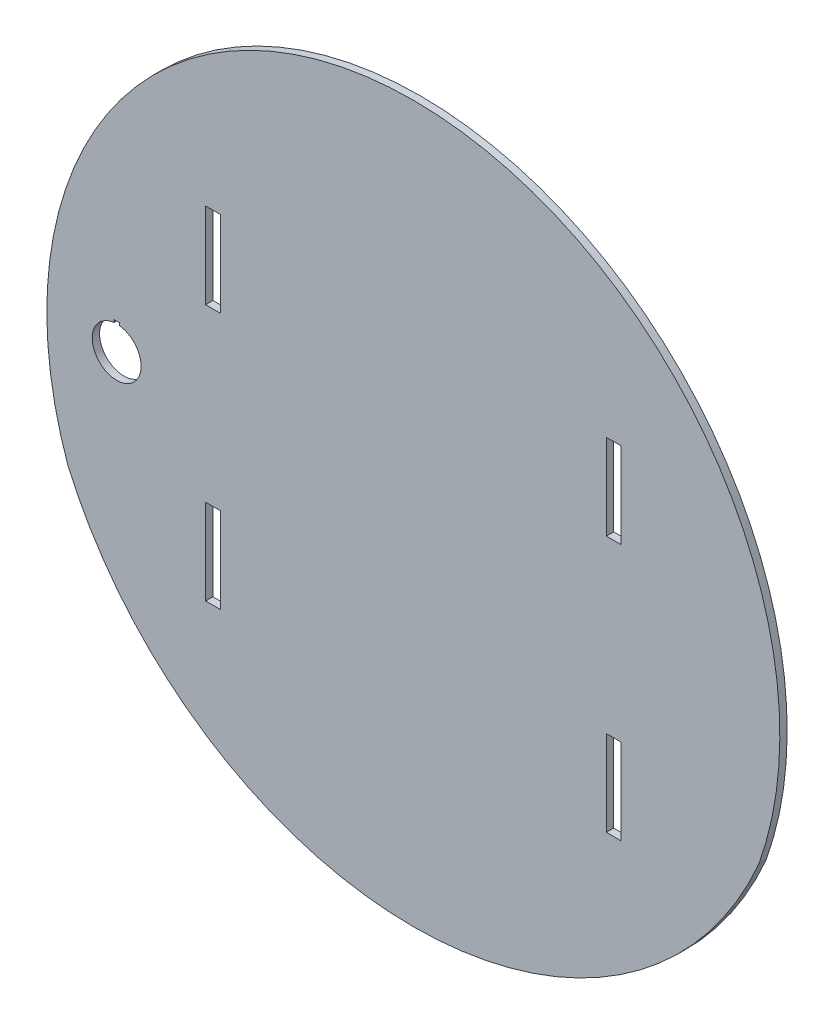
ISO-10303-21;
HEADER;
FILE_DESCRIPTION(('STEP AP214'),'2;1');
FILE_NAME('part.step','',(''),(''),'','','');
FILE_SCHEMA(('AUTOMOTIVE_DESIGN { 1 0 10303 214 1 1 1 1 }'));
ENDSEC;
DATA;
#1=APPLICATION_CONTEXT('core data for automotive mechanical design processes');
#2=APPLICATION_PROTOCOL_DEFINITION('international standard','automotive_design',2000,#1);
#3=PRODUCT_CONTEXT('',#1,'mechanical');
#4=PRODUCT('Part','Part','',(#3));
#5=PRODUCT_RELATED_PRODUCT_CATEGORY('part','',(#4));
#6=PRODUCT_DEFINITION_FORMATION('','',#4);
#7=PRODUCT_DEFINITION_CONTEXT('part definition',#1,'design');
#8=PRODUCT_DEFINITION('design','',#6,#7);
#9=PRODUCT_DEFINITION_SHAPE('','',#8);
#10=(LENGTH_UNIT() NAMED_UNIT(*) SI_UNIT(.MILLI.,.METRE.));
#11=(NAMED_UNIT(*) PLANE_ANGLE_UNIT() SI_UNIT($,.RADIAN.));
#12=(NAMED_UNIT(*) SI_UNIT($,.STERADIAN.) SOLID_ANGLE_UNIT());
#13=UNCERTAINTY_MEASURE_WITH_UNIT(LENGTH_MEASURE(1.E-05),#10,'distance_accuracy_value','');
#14=(GEOMETRIC_REPRESENTATION_CONTEXT(3) GLOBAL_UNCERTAINTY_ASSIGNED_CONTEXT((#13)) GLOBAL_UNIT_ASSIGNED_CONTEXT((#10,
#11,#12)) REPRESENTATION_CONTEXT('',''));
#15=CARTESIAN_POINT('',(0.,0.,0.));
#16=DIRECTION('',(0.,0.,1.));
#17=DIRECTION('',(1.,0.,0.));
#18=AXIS2_PLACEMENT_3D('',#15,#16,#17);
#19=CARTESIAN_POINT('',(0.,5.54868131109093,3.));
#20=DIRECTION('',(0.,0.,-1.));
#21=DIRECTION('',(-1.,0.,0.));
#22=AXIS2_PLACEMENT_3D('',#19,#20,#21);
#23=PLANE('',#22);
#24=DIRECTION('',(0.,1.,0.));
#25=VECTOR('',#24,1.);
#26=CARTESIAN_POINT('',(85.0000000000001,-70.,3.));
#27=LINE('',#26,#25);
#28=CARTESIAN_POINT('',(85.0000000000001,-70.,3.));
#29=VERTEX_POINT('',#28);
#30=CARTESIAN_POINT('',(85.0000000000001,-35.,3.));
#31=VERTEX_POINT('',#30);
#32=EDGE_CURVE('E218',#29,#31,#27,.T.);
#33=ORIENTED_EDGE('',*,*,#32,.F.);
#34=DIRECTION('',(1.,0.,0.));
#35=VECTOR('',#34,1.);
#36=CARTESIAN_POINT('',(85.0000000000001,-70.,3.));
#37=LINE('',#36,#35);
#38=CARTESIAN_POINT('',(79.0000000000001,-70.,3.));
#39=VERTEX_POINT('',#38);
#40=EDGE_CURVE('E226',#39,#29,#37,.T.);
#41=ORIENTED_EDGE('',*,*,#40,.F.);
#42=DIRECTION('',(0.,-1.,0.));
#43=VECTOR('',#42,1.);
#44=CARTESIAN_POINT('',(79.0000000000001,-70.,3.));
#45=LINE('',#44,#43);
#46=CARTESIAN_POINT('',(79.0000000000001,-35.,3.));
#47=VERTEX_POINT('',#46);
#48=EDGE_CURVE('E223',#47,#39,#45,.T.);
#49=ORIENTED_EDGE('',*,*,#48,.F.);
#50=DIRECTION('',(-1.,0.,0.));
#51=VECTOR('',#50,1.);
#52=CARTESIAN_POINT('',(85.0000000000001,-35.,3.));
#53=LINE('',#52,#51);
#54=EDGE_CURVE('E220',#31,#47,#53,.T.);
#55=ORIENTED_EDGE('',*,*,#54,.F.);
#56=EDGE_LOOP('',(#33,#41,#49,#55));
#57=FACE_BOUND('',#56,.T.);
#58=DIRECTION('',(0.,-1.,0.));
#59=VECTOR('',#58,1.);
#60=CARTESIAN_POINT('',(-122.52135623731,11.,3.));
#61=LINE('',#60,#59);
#62=CARTESIAN_POINT('',(-122.52135623731,11.,3.));
#63=VERTEX_POINT('',#62);
#64=CARTESIAN_POINT('',(-122.52135623731,9.93931587182939,3.));
#65=VERTEX_POINT('',#64);
#66=EDGE_CURVE('E280',#63,#65,#61,.T.);
#67=ORIENTED_EDGE('',*,*,#66,.F.);
#68=DIRECTION('',(-1.,0.,0.));
#69=VECTOR('',#68,1.);
#70=CARTESIAN_POINT('',(-120.32135623731,11.,3.));
#71=LINE('',#70,#69);
#72=CARTESIAN_POINT('',(-120.32135623731,11.,3.));
#73=VERTEX_POINT('',#72);
#74=EDGE_CURVE('E288',#73,#63,#71,.T.);
#75=ORIENTED_EDGE('',*,*,#74,.F.);
#76=DIRECTION('',(0.,1.,0.));
#77=VECTOR('',#76,1.);
#78=CARTESIAN_POINT('',(-120.32135623731,11.,3.));
#79=LINE('',#78,#77);
#80=CARTESIAN_POINT('',(-120.32135623731,9.93931587182939,3.));
#81=VERTEX_POINT('',#80);
#82=EDGE_CURVE('E285',#81,#73,#79,.T.);
#83=ORIENTED_EDGE('',*,*,#82,.F.);
#84=CARTESIAN_POINT('',(-121.42135623731,0.,3.));
#85=DIRECTION('',(0.,0.,1.));
#86=DIRECTION('',(1.,0.,0.));
#87=AXIS2_PLACEMENT_3D('',#84,#85,#86);
#88=CIRCLE('',#87,10.);
#89=EDGE_CURVE('E282',#65,#81,#88,.T.);
#90=ORIENTED_EDGE('',*,*,#89,.F.);
#91=EDGE_LOOP('',(#67,#75,#83,#90));
#92=FACE_BOUND('',#91,.T.);
#93=CARTESIAN_POINT('',(0.,11.0973626221819,3.));
#94=DIRECTION('',(0.,0.,1.));
#95=DIRECTION('',(-1.,0.,0.));
#96=AXIS2_PLACEMENT_3D('',#93,#94,#95);
#97=CIRCLE('',#96,154.054820500322);
#98=CARTESIAN_POINT('',(-141.42135623731,-49.9999999999998,3.));
#99=VERTEX_POINT('',#98);
#100=CARTESIAN_POINT('',(141.421356237309,-50.,3.));
#101=VERTEX_POINT('',#100);
#102=EDGE_CURVE('E342',#99,#101,#97,.T.);
#103=ORIENTED_EDGE('',*,*,#102,.T.);
#104=CARTESIAN_POINT('',(0.,0.,3.));
#105=DIRECTION('',(0.,0.,1.));
#106=DIRECTION('',(1.,0.,0.));
#107=AXIS2_PLACEMENT_3D('',#104,#105,#106);
#108=CIRCLE('',#107,150.);
#109=EDGE_CURVE('E345',#101,#99,#108,.T.);
#110=ORIENTED_EDGE('',*,*,#109,.T.);
#111=EDGE_LOOP('',(#103,#110));
#112=FACE_BOUND('',#111,.T.);
#113=DIRECTION('',(1.,0.,0.));
#114=VECTOR('',#113,1.);
#115=CARTESIAN_POINT('',(-85.,-70.,3.));
#116=LINE('',#115,#114);
#117=CARTESIAN_POINT('',(-85.,-70.,3.));
#118=VERTEX_POINT('',#117);
#119=CARTESIAN_POINT('',(-79.,-70.,3.));
#120=VERTEX_POINT('',#119);
#121=EDGE_CURVE('E311',#118,#120,#116,.T.);
#122=ORIENTED_EDGE('',*,*,#121,.F.);
#123=DIRECTION('',(0.,-1.,0.));
#124=VECTOR('',#123,1.);
#125=CARTESIAN_POINT('',(-85.,-70.,3.));
#126=LINE('',#125,#124);
#127=CARTESIAN_POINT('',(-85.,-35.,3.));
#128=VERTEX_POINT('',#127);
#129=EDGE_CURVE('E319',#128,#118,#126,.T.);
#130=ORIENTED_EDGE('',*,*,#129,.F.);
#131=DIRECTION('',(-1.,0.,0.));
#132=VECTOR('',#131,1.);
#133=CARTESIAN_POINT('',(-85.,-35.,3.));
#134=LINE('',#133,#132);
#135=CARTESIAN_POINT('',(-79.,-35.,3.));
#136=VERTEX_POINT('',#135);
#137=EDGE_CURVE('E316',#136,#128,#134,.T.);
#138=ORIENTED_EDGE('',*,*,#137,.F.);
#139=DIRECTION('',(0.,1.,0.));
#140=VECTOR('',#139,1.);
#141=CARTESIAN_POINT('',(-79.,-70.,3.));
#142=LINE('',#141,#140);
#143=EDGE_CURVE('E313',#120,#136,#142,.T.);
#144=ORIENTED_EDGE('',*,*,#143,.F.);
#145=EDGE_LOOP('',(#122,#130,#138,#144));
#146=FACE_BOUND('',#145,.T.);
#147=DIRECTION('',(0.,-1.,0.));
#148=VECTOR('',#147,1.);
#149=CARTESIAN_POINT('',(-85.,35.,3.));
#150=LINE('',#149,#148);
#151=CARTESIAN_POINT('',(-85.,70.,3.));
#152=VERTEX_POINT('',#151);
#153=CARTESIAN_POINT('',(-85.,35.,3.));
#154=VERTEX_POINT('',#153);
#155=EDGE_CURVE('E249',#152,#154,#150,.T.);
#156=ORIENTED_EDGE('',*,*,#155,.F.);
#157=DIRECTION('',(-1.,0.,0.));
#158=VECTOR('',#157,1.);
#159=CARTESIAN_POINT('',(-85.,70.,3.));
#160=LINE('',#159,#158);
#161=CARTESIAN_POINT('',(-79.,70.,3.));
#162=VERTEX_POINT('',#161);
#163=EDGE_CURVE('E257',#162,#152,#160,.T.);
#164=ORIENTED_EDGE('',*,*,#163,.F.);
#165=DIRECTION('',(0.,1.,0.));
#166=VECTOR('',#165,1.);
#167=CARTESIAN_POINT('',(-79.,35.,3.));
#168=LINE('',#167,#166);
#169=CARTESIAN_POINT('',(-79.,35.,3.));
#170=VERTEX_POINT('',#169);
#171=EDGE_CURVE('E254',#170,#162,#168,.T.);
#172=ORIENTED_EDGE('',*,*,#171,.F.);
#173=DIRECTION('',(1.,0.,0.));
#174=VECTOR('',#173,1.);
#175=CARTESIAN_POINT('',(-85.,35.,3.));
#176=LINE('',#175,#174);
#177=EDGE_CURVE('E251',#154,#170,#176,.T.);
#178=ORIENTED_EDGE('',*,*,#177,.F.);
#179=EDGE_LOOP('',(#156,#164,#172,#178));
#180=FACE_BOUND('',#179,.T.);
#181=DIRECTION('',(1.,0.,0.));
#182=VECTOR('',#181,1.);
#183=CARTESIAN_POINT('',(85.,35.,3.));
#184=LINE('',#183,#182);
#185=CARTESIAN_POINT('',(79.,35.,3.));
#186=VERTEX_POINT('',#185);
#187=CARTESIAN_POINT('',(85.,35.,3.));
#188=VERTEX_POINT('',#187);
#189=EDGE_CURVE('E182',#186,#188,#184,.T.);
#190=ORIENTED_EDGE('',*,*,#189,.F.);
#191=DIRECTION('',(0.,-1.,0.));
#192=VECTOR('',#191,1.);
#193=CARTESIAN_POINT('',(79.,35.,3.));
#194=LINE('',#193,#192);
#195=CARTESIAN_POINT('',(79.0000000000001,70.,3.));
#196=VERTEX_POINT('',#195);
#197=EDGE_CURVE('E204',#196,#186,#194,.T.);
#198=ORIENTED_EDGE('',*,*,#197,.F.);
#199=DIRECTION('',(-1.,0.,0.));
#200=VECTOR('',#199,1.);
#201=CARTESIAN_POINT('',(85.0000000000001,70.,3.));
#202=LINE('',#201,#200);
#203=CARTESIAN_POINT('',(85.0000000000001,70.,3.));
#204=VERTEX_POINT('',#203);
#205=EDGE_CURVE('E202',#204,#196,#202,.T.);
#206=ORIENTED_EDGE('',*,*,#205,.F.);
#207=DIRECTION('',(0.,1.,0.));
#208=VECTOR('',#207,1.);
#209=CARTESIAN_POINT('',(85.,35.,3.));
#210=LINE('',#209,#208);
#211=EDGE_CURVE('E190',#188,#204,#210,.T.);
#212=ORIENTED_EDGE('',*,*,#211,.F.);
#213=EDGE_LOOP('',(#190,#198,#206,#212));
#214=FACE_BOUND('',#213,.T.);
#215=ADVANCED_FACE('F33',(#57,#92,#112,#146,#180,#214),#23,.F.);
#216=CARTESIAN_POINT('',(0.,5.54868131109093,0.));
#217=DIRECTION('',(0.,0.,-1.));
#218=DIRECTION('',(-1.,0.,0.));
#219=AXIS2_PLACEMENT_3D('',#216,#217,#218);
#220=PLANE('',#219);
#221=CARTESIAN_POINT('',(0.,11.0973626221819,0.));
#222=DIRECTION('',(0.,0.,1.));
#223=DIRECTION('',(-1.,0.,0.));
#224=AXIS2_PLACEMENT_3D('',#221,#222,#223);
#225=CIRCLE('',#224,154.054820500322);
#226=CARTESIAN_POINT('',(-141.42135623731,-49.9999999999998,0.));
#227=VERTEX_POINT('',#226);
#228=CARTESIAN_POINT('',(141.421356237309,-50.,0.));
#229=VERTEX_POINT('',#228);
#230=EDGE_CURVE('E341',#227,#229,#225,.T.);
#231=ORIENTED_EDGE('',*,*,#230,.F.);
#232=CARTESIAN_POINT('',(0.,0.,0.));
#233=DIRECTION('',(0.,0.,1.));
#234=DIRECTION('',(1.,0.,0.));
#235=AXIS2_PLACEMENT_3D('',#232,#233,#234);
#236=CIRCLE('',#235,150.);
#237=EDGE_CURVE('E346',#229,#227,#236,.T.);
#238=ORIENTED_EDGE('',*,*,#237,.F.);
#239=EDGE_LOOP('',(#231,#238));
#240=FACE_BOUND('',#239,.T.);
#241=DIRECTION('',(0.,-1.,0.));
#242=VECTOR('',#241,1.);
#243=CARTESIAN_POINT('',(-85.,-70.,0.));
#244=LINE('',#243,#242);
#245=CARTESIAN_POINT('',(-85.,-35.,0.));
#246=VERTEX_POINT('',#245);
#247=CARTESIAN_POINT('',(-85.,-70.,0.));
#248=VERTEX_POINT('',#247);
#249=EDGE_CURVE('E314',#246,#248,#244,.T.);
#250=ORIENTED_EDGE('',*,*,#249,.T.);
#251=DIRECTION('',(1.,0.,0.));
#252=VECTOR('',#251,1.);
#253=CARTESIAN_POINT('',(-85.,-70.,0.));
#254=LINE('',#253,#252);
#255=CARTESIAN_POINT('',(-79.,-70.,0.));
#256=VERTEX_POINT('',#255);
#257=EDGE_CURVE('E310',#248,#256,#254,.T.);
#258=ORIENTED_EDGE('',*,*,#257,.T.);
#259=DIRECTION('',(0.,1.,0.));
#260=VECTOR('',#259,1.);
#261=CARTESIAN_POINT('',(-79.,-70.,0.));
#262=LINE('',#261,#260);
#263=CARTESIAN_POINT('',(-79.,-35.,0.));
#264=VERTEX_POINT('',#263);
#265=EDGE_CURVE('E324',#256,#264,#262,.T.);
#266=ORIENTED_EDGE('',*,*,#265,.T.);
#267=DIRECTION('',(-1.,0.,0.));
#268=VECTOR('',#267,1.);
#269=CARTESIAN_POINT('',(-85.,-35.,0.));
#270=LINE('',#269,#268);
#271=EDGE_CURVE('E327',#264,#246,#270,.T.);
#272=ORIENTED_EDGE('',*,*,#271,.T.);
#273=EDGE_LOOP('',(#250,#258,#266,#272));
#274=FACE_BOUND('',#273,.T.);
#275=DIRECTION('',(-1.,0.,0.));
#276=VECTOR('',#275,1.);
#277=CARTESIAN_POINT('',(-120.32135623731,11.,0.));
#278=LINE('',#277,#276);
#279=CARTESIAN_POINT('',(-120.32135623731,11.,0.));
#280=VERTEX_POINT('',#279);
#281=CARTESIAN_POINT('',(-122.52135623731,11.,0.));
#282=VERTEX_POINT('',#281);
#283=EDGE_CURVE('E283',#280,#282,#278,.T.);
#284=ORIENTED_EDGE('',*,*,#283,.T.);
#285=DIRECTION('',(0.,-1.,0.));
#286=VECTOR('',#285,1.);
#287=CARTESIAN_POINT('',(-122.52135623731,11.,0.));
#288=LINE('',#287,#286);
#289=CARTESIAN_POINT('',(-122.52135623731,9.93931587182939,0.));
#290=VERTEX_POINT('',#289);
#291=EDGE_CURVE('E279',#282,#290,#288,.T.);
#292=ORIENTED_EDGE('',*,*,#291,.T.);
#293=CARTESIAN_POINT('',(-121.42135623731,0.,0.));
#294=DIRECTION('',(0.,0.,1.));
#295=DIRECTION('',(1.,0.,0.));
#296=AXIS2_PLACEMENT_3D('',#293,#294,#295);
#297=CIRCLE('',#296,10.);
#298=CARTESIAN_POINT('',(-120.32135623731,9.93931587182939,0.));
#299=VERTEX_POINT('',#298);
#300=EDGE_CURVE('E293',#290,#299,#297,.T.);
#301=ORIENTED_EDGE('',*,*,#300,.T.);
#302=DIRECTION('',(0.,1.,0.));
#303=VECTOR('',#302,1.);
#304=CARTESIAN_POINT('',(-120.32135623731,11.,0.));
#305=LINE('',#304,#303);
#306=EDGE_CURVE('E296',#299,#280,#305,.T.);
#307=ORIENTED_EDGE('',*,*,#306,.T.);
#308=EDGE_LOOP('',(#284,#292,#301,#307));
#309=FACE_BOUND('',#308,.T.);
#310=DIRECTION('',(-1.,0.,0.));
#311=VECTOR('',#310,1.);
#312=CARTESIAN_POINT('',(-85.,70.,0.));
#313=LINE('',#312,#311);
#314=CARTESIAN_POINT('',(-79.,70.,0.));
#315=VERTEX_POINT('',#314);
#316=CARTESIAN_POINT('',(-85.,70.,0.));
#317=VERTEX_POINT('',#316);
#318=EDGE_CURVE('E252',#315,#317,#313,.T.);
#319=ORIENTED_EDGE('',*,*,#318,.T.);
#320=DIRECTION('',(0.,-1.,0.));
#321=VECTOR('',#320,1.);
#322=CARTESIAN_POINT('',(-85.,35.,0.));
#323=LINE('',#322,#321);
#324=CARTESIAN_POINT('',(-85.,35.,0.));
#325=VERTEX_POINT('',#324);
#326=EDGE_CURVE('E248',#317,#325,#323,.T.);
#327=ORIENTED_EDGE('',*,*,#326,.T.);
#328=DIRECTION('',(1.,0.,0.));
#329=VECTOR('',#328,1.);
#330=CARTESIAN_POINT('',(-85.,35.,0.));
#331=LINE('',#330,#329);
#332=CARTESIAN_POINT('',(-79.,35.,0.));
#333=VERTEX_POINT('',#332);
#334=EDGE_CURVE('E262',#325,#333,#331,.T.);
#335=ORIENTED_EDGE('',*,*,#334,.T.);
#336=DIRECTION('',(0.,1.,0.));
#337=VECTOR('',#336,1.);
#338=CARTESIAN_POINT('',(-79.,35.,0.));
#339=LINE('',#338,#337);
#340=EDGE_CURVE('E265',#333,#315,#339,.T.);
#341=ORIENTED_EDGE('',*,*,#340,.T.);
#342=EDGE_LOOP('',(#319,#327,#335,#341));
#343=FACE_BOUND('',#342,.T.);
#344=DIRECTION('',(1.,0.,0.));
#345=VECTOR('',#344,1.);
#346=CARTESIAN_POINT('',(85.0000000000001,-70.,0.));
#347=LINE('',#346,#345);
#348=CARTESIAN_POINT('',(79.0000000000001,-70.,0.));
#349=VERTEX_POINT('',#348);
#350=CARTESIAN_POINT('',(85.0000000000001,-70.,0.));
#351=VERTEX_POINT('',#350);
#352=EDGE_CURVE('E221',#349,#351,#347,.T.);
#353=ORIENTED_EDGE('',*,*,#352,.T.);
#354=DIRECTION('',(0.,1.,0.));
#355=VECTOR('',#354,1.);
#356=CARTESIAN_POINT('',(85.0000000000001,-70.,0.));
#357=LINE('',#356,#355);
#358=CARTESIAN_POINT('',(85.0000000000001,-35.,0.));
#359=VERTEX_POINT('',#358);
#360=EDGE_CURVE('E198',#351,#359,#357,.T.);
#361=ORIENTED_EDGE('',*,*,#360,.T.);
#362=DIRECTION('',(-1.,0.,0.));
#363=VECTOR('',#362,1.);
#364=CARTESIAN_POINT('',(85.0000000000001,-35.,0.));
#365=LINE('',#364,#363);
#366=CARTESIAN_POINT('',(79.0000000000001,-35.,0.));
#367=VERTEX_POINT('',#366);
#368=EDGE_CURVE('E231',#359,#367,#365,.T.);
#369=ORIENTED_EDGE('',*,*,#368,.T.);
#370=DIRECTION('',(0.,-1.,0.));
#371=VECTOR('',#370,1.);
#372=CARTESIAN_POINT('',(79.0000000000001,-70.,0.));
#373=LINE('',#372,#371);
#374=EDGE_CURVE('E234',#367,#349,#373,.T.);
#375=ORIENTED_EDGE('',*,*,#374,.T.);
#376=EDGE_LOOP('',(#353,#361,#369,#375));
#377=FACE_BOUND('',#376,.T.);
#378=DIRECTION('',(0.,-1.,0.));
#379=VECTOR('',#378,1.);
#380=CARTESIAN_POINT('',(79.,35.,0.));
#381=LINE('',#380,#379);
#382=CARTESIAN_POINT('',(79.0000000000001,70.,0.));
#383=VERTEX_POINT('',#382);
#384=CARTESIAN_POINT('',(79.,35.,0.));
#385=VERTEX_POINT('',#384);
#386=EDGE_CURVE('E191',#383,#385,#381,.T.);
#387=ORIENTED_EDGE('',*,*,#386,.T.);
#388=DIRECTION('',(1.,0.,0.));
#389=VECTOR('',#388,1.);
#390=CARTESIAN_POINT('',(85.,35.,0.));
#391=LINE('',#390,#389);
#392=CARTESIAN_POINT('',(85.,35.,0.));
#393=VERTEX_POINT('',#392);
#394=EDGE_CURVE('E56',#385,#393,#391,.T.);
#395=ORIENTED_EDGE('',*,*,#394,.T.);
#396=DIRECTION('',(0.,1.,0.));
#397=VECTOR('',#396,1.);
#398=CARTESIAN_POINT('',(85.,35.,0.));
#399=LINE('',#398,#397);
#400=CARTESIAN_POINT('',(85.0000000000001,70.,0.));
#401=VERTEX_POINT('',#400);
#402=EDGE_CURVE('E197',#393,#401,#399,.T.);
#403=ORIENTED_EDGE('',*,*,#402,.T.);
#404=DIRECTION('',(-1.,0.,0.));
#405=VECTOR('',#404,1.);
#406=CARTESIAN_POINT('',(85.0000000000001,70.,0.));
#407=LINE('',#406,#405);
#408=EDGE_CURVE('E210',#401,#383,#407,.T.);
#409=ORIENTED_EDGE('',*,*,#408,.T.);
#410=EDGE_LOOP('',(#387,#395,#403,#409));
#411=FACE_BOUND('',#410,.T.);
#412=ADVANCED_FACE('F358',(#240,#274,#309,#343,#377,#411),#220,.T.);
#413=CARTESIAN_POINT('',(0.,11.0973626221819,3.));
#414=DIRECTION('',(0.,0.,-1.));
#415=DIRECTION('',(-1.,0.,0.));
#416=AXIS2_PLACEMENT_3D('',#413,#414,#415);
#417=CYLINDRICAL_SURFACE('',#416,154.054820500322);
#418=ORIENTED_EDGE('',*,*,#230,.T.);
#419=DIRECTION('',(0.,0.,-1.));
#420=VECTOR('',#419,1.);
#421=CARTESIAN_POINT('',(141.421356237309,-50.,3.));
#422=LINE('',#421,#420);
#423=EDGE_CURVE('E11',#101,#229,#422,.T.);
#424=ORIENTED_EDGE('',*,*,#423,.F.);
#425=ORIENTED_EDGE('',*,*,#102,.F.);
#426=DIRECTION('',(0.,0.,-1.));
#427=VECTOR('',#426,1.);
#428=CARTESIAN_POINT('',(-141.42135623731,-49.9999999999998,3.));
#429=LINE('',#428,#427);
#430=EDGE_CURVE('E41',#99,#227,#429,.T.);
#431=ORIENTED_EDGE('',*,*,#430,.T.);
#432=EDGE_LOOP('',(#418,#424,#425,#431));
#433=FACE_BOUND('',#432,.T.);
#434=ADVANCED_FACE('F35',(#433),#417,.T.);
#435=CARTESIAN_POINT('',(0.,0.,3.));
#436=DIRECTION('',(0.,0.,-1.));
#437=DIRECTION('',(-1.,0.,0.));
#438=AXIS2_PLACEMENT_3D('',#435,#436,#437);
#439=CYLINDRICAL_SURFACE('',#438,150.);
#440=ORIENTED_EDGE('',*,*,#237,.T.);
#441=ORIENTED_EDGE('',*,*,#430,.F.);
#442=ORIENTED_EDGE('',*,*,#109,.F.);
#443=ORIENTED_EDGE('',*,*,#423,.T.);
#444=EDGE_LOOP('',(#440,#441,#442,#443));
#445=FACE_BOUND('',#444,.T.);
#446=ADVANCED_FACE('F360',(#445),#439,.T.);
#447=CARTESIAN_POINT('',(-85.,-70.,3.));
#448=DIRECTION('',(0.,1.,0.));
#449=DIRECTION('',(-1.,0.,0.));
#450=AXIS2_PLACEMENT_3D('',#447,#448,#449);
#451=PLANE('',#450);
#452=ORIENTED_EDGE('',*,*,#257,.F.);
#453=DIRECTION('',(0.,0.,-1.));
#454=VECTOR('',#453,1.);
#455=CARTESIAN_POINT('',(-85.,-70.,3.));
#456=LINE('',#455,#454);
#457=EDGE_CURVE('E321',#118,#248,#456,.T.);
#458=ORIENTED_EDGE('',*,*,#457,.F.);
#459=ORIENTED_EDGE('',*,*,#121,.T.);
#460=DIRECTION('',(0.,0.,-1.));
#461=VECTOR('',#460,1.);
#462=CARTESIAN_POINT('',(-79.,-70.,3.));
#463=LINE('',#462,#461);
#464=EDGE_CURVE('E338',#120,#256,#463,.T.);
#465=ORIENTED_EDGE('',*,*,#464,.T.);
#466=EDGE_LOOP('',(#452,#458,#459,#465));
#467=FACE_BOUND('',#466,.T.);
#468=ADVANCED_FACE('F429',(#467),#451,.T.);
#469=CARTESIAN_POINT('',(-79.,-70.,3.));
#470=DIRECTION('',(-1.,0.,0.));
#471=DIRECTION('',(0.,0.,1.));
#472=AXIS2_PLACEMENT_3D('',#469,#470,#471);
#473=PLANE('',#472);
#474=ORIENTED_EDGE('',*,*,#265,.F.);
#475=ORIENTED_EDGE('',*,*,#464,.F.);
#476=ORIENTED_EDGE('',*,*,#143,.T.);
#477=DIRECTION('',(0.,0.,-1.));
#478=VECTOR('',#477,1.);
#479=CARTESIAN_POINT('',(-79.,-35.,3.));
#480=LINE('',#479,#478);
#481=EDGE_CURVE('E336',#136,#264,#480,.T.);
#482=ORIENTED_EDGE('',*,*,#481,.T.);
#483=EDGE_LOOP('',(#474,#475,#476,#482));
#484=FACE_BOUND('',#483,.T.);
#485=ADVANCED_FACE('F425',(#484),#473,.T.);
#486=CARTESIAN_POINT('',(-85.,-35.,3.));
#487=DIRECTION('',(0.,-1.,0.));
#488=DIRECTION('',(0.,0.,-1.));
#489=AXIS2_PLACEMENT_3D('',#486,#487,#488);
#490=PLANE('',#489);
#491=ORIENTED_EDGE('',*,*,#271,.F.);
#492=ORIENTED_EDGE('',*,*,#481,.F.);
#493=ORIENTED_EDGE('',*,*,#137,.T.);
#494=DIRECTION('',(0.,0.,-1.));
#495=VECTOR('',#494,1.);
#496=CARTESIAN_POINT('',(-85.,-35.,3.));
#497=LINE('',#496,#495);
#498=EDGE_CURVE('E334',#128,#246,#497,.T.);
#499=ORIENTED_EDGE('',*,*,#498,.T.);
#500=EDGE_LOOP('',(#491,#492,#493,#499));
#501=FACE_BOUND('',#500,.T.);
#502=ADVANCED_FACE('F421',(#501),#490,.T.);
#503=CARTESIAN_POINT('',(-85.,-70.,3.));
#504=DIRECTION('',(1.,0.,0.));
#505=DIRECTION('',(0.,0.,-1.));
#506=AXIS2_PLACEMENT_3D('',#503,#504,#505);
#507=PLANE('',#506);
#508=ORIENTED_EDGE('',*,*,#249,.F.);
#509=ORIENTED_EDGE('',*,*,#498,.F.);
#510=ORIENTED_EDGE('',*,*,#129,.T.);
#511=ORIENTED_EDGE('',*,*,#457,.T.);
#512=EDGE_LOOP('',(#508,#509,#510,#511));
#513=FACE_BOUND('',#512,.T.);
#514=ADVANCED_FACE('F417',(#513),#507,.T.);
#515=CARTESIAN_POINT('',(-122.52135623731,11.,3.));
#516=DIRECTION('',(1.,0.,0.));
#517=DIRECTION('',(0.,0.,-1.));
#518=AXIS2_PLACEMENT_3D('',#515,#516,#517);
#519=PLANE('',#518);
#520=ORIENTED_EDGE('',*,*,#291,.F.);
#521=DIRECTION('',(0.,0.,-1.));
#522=VECTOR('',#521,1.);
#523=CARTESIAN_POINT('',(-122.52135623731,11.,3.));
#524=LINE('',#523,#522);
#525=EDGE_CURVE('E290',#63,#282,#524,.T.);
#526=ORIENTED_EDGE('',*,*,#525,.F.);
#527=ORIENTED_EDGE('',*,*,#66,.T.);
#528=DIRECTION('',(0.,0.,-1.));
#529=VECTOR('',#528,1.);
#530=CARTESIAN_POINT('',(-122.52135623731,9.93931587182939,3.));
#531=LINE('',#530,#529);
#532=EDGE_CURVE('E307',#65,#290,#531,.T.);
#533=ORIENTED_EDGE('',*,*,#532,.T.);
#534=EDGE_LOOP('',(#520,#526,#527,#533));
#535=FACE_BOUND('',#534,.T.);
#536=ADVANCED_FACE('F413',(#535),#519,.T.);
#537=CARTESIAN_POINT('',(-121.42135623731,0.,3.));
#538=DIRECTION('',(0.,0.,-1.));
#539=DIRECTION('',(-1.,0.,0.));
#540=AXIS2_PLACEMENT_3D('',#537,#538,#539);
#541=CYLINDRICAL_SURFACE('',#540,10.);
#542=ORIENTED_EDGE('',*,*,#300,.F.);
#543=ORIENTED_EDGE('',*,*,#532,.F.);
#544=ORIENTED_EDGE('',*,*,#89,.T.);
#545=DIRECTION('',(0.,0.,-1.));
#546=VECTOR('',#545,1.);
#547=CARTESIAN_POINT('',(-120.32135623731,9.93931587182939,3.));
#548=LINE('',#547,#546);
#549=EDGE_CURVE('E305',#81,#299,#548,.T.);
#550=ORIENTED_EDGE('',*,*,#549,.T.);
#551=EDGE_LOOP('',(#542,#543,#544,#550));
#552=FACE_BOUND('',#551,.T.);
#553=ADVANCED_FACE('F409',(#552),#541,.F.);
#554=CARTESIAN_POINT('',(-120.32135623731,11.,3.));
#555=DIRECTION('',(-1.,0.,0.));
#556=DIRECTION('',(0.,0.,1.));
#557=AXIS2_PLACEMENT_3D('',#554,#555,#556);
#558=PLANE('',#557);
#559=ORIENTED_EDGE('',*,*,#306,.F.);
#560=ORIENTED_EDGE('',*,*,#549,.F.);
#561=ORIENTED_EDGE('',*,*,#82,.T.);
#562=DIRECTION('',(0.,0.,-1.));
#563=VECTOR('',#562,1.);
#564=CARTESIAN_POINT('',(-120.32135623731,11.,3.));
#565=LINE('',#564,#563);
#566=EDGE_CURVE('E303',#73,#280,#565,.T.);
#567=ORIENTED_EDGE('',*,*,#566,.T.);
#568=EDGE_LOOP('',(#559,#560,#561,#567));
#569=FACE_BOUND('',#568,.T.);
#570=ADVANCED_FACE('F405',(#569),#558,.T.);
#571=CARTESIAN_POINT('',(-120.32135623731,11.,3.));
#572=DIRECTION('',(0.,-1.,0.));
#573=DIRECTION('',(0.,0.,-1.));
#574=AXIS2_PLACEMENT_3D('',#571,#572,#573);
#575=PLANE('',#574);
#576=ORIENTED_EDGE('',*,*,#283,.F.);
#577=ORIENTED_EDGE('',*,*,#566,.F.);
#578=ORIENTED_EDGE('',*,*,#74,.T.);
#579=ORIENTED_EDGE('',*,*,#525,.T.);
#580=EDGE_LOOP('',(#576,#577,#578,#579));
#581=FACE_BOUND('',#580,.T.);
#582=ADVANCED_FACE('F402',(#581),#575,.T.);
#583=CARTESIAN_POINT('',(-85.,35.,3.));
#584=DIRECTION('',(1.,0.,0.));
#585=DIRECTION('',(0.,1.,0.));
#586=AXIS2_PLACEMENT_3D('',#583,#584,#585);
#587=PLANE('',#586);
#588=ORIENTED_EDGE('',*,*,#326,.F.);
#589=DIRECTION('',(0.,0.,-1.));
#590=VECTOR('',#589,1.);
#591=CARTESIAN_POINT('',(-85.,70.,3.));
#592=LINE('',#591,#590);
#593=EDGE_CURVE('E259',#152,#317,#592,.T.);
#594=ORIENTED_EDGE('',*,*,#593,.F.);
#595=ORIENTED_EDGE('',*,*,#155,.T.);
#596=DIRECTION('',(0.,0.,-1.));
#597=VECTOR('',#596,1.);
#598=CARTESIAN_POINT('',(-85.,35.,3.));
#599=LINE('',#598,#597);
#600=EDGE_CURVE('E276',#154,#325,#599,.T.);
#601=ORIENTED_EDGE('',*,*,#600,.T.);
#602=EDGE_LOOP('',(#588,#594,#595,#601));
#603=FACE_BOUND('',#602,.T.);
#604=ADVANCED_FACE('F377',(#603),#587,.T.);
#605=CARTESIAN_POINT('',(-85.,35.,3.));
#606=DIRECTION('',(0.,1.,0.));
#607=DIRECTION('',(0.,0.,1.));
#608=AXIS2_PLACEMENT_3D('',#605,#606,#607);
#609=PLANE('',#608);
#610=ORIENTED_EDGE('',*,*,#334,.F.);
#611=ORIENTED_EDGE('',*,*,#600,.F.);
#612=ORIENTED_EDGE('',*,*,#177,.T.);
#613=DIRECTION('',(0.,0.,-1.));
#614=VECTOR('',#613,1.);
#615=CARTESIAN_POINT('',(-79.,35.,3.));
#616=LINE('',#615,#614);
#617=EDGE_CURVE('E274',#170,#333,#616,.T.);
#618=ORIENTED_EDGE('',*,*,#617,.T.);
#619=EDGE_LOOP('',(#610,#611,#612,#618));
#620=FACE_BOUND('',#619,.T.);
#621=ADVANCED_FACE('F379',(#620),#609,.T.);
#622=CARTESIAN_POINT('',(-79.,35.,3.));
#623=DIRECTION('',(-1.,0.,0.));
#624=DIRECTION('',(0.,-1.,0.));
#625=AXIS2_PLACEMENT_3D('',#622,#623,#624);
#626=PLANE('',#625);
#627=ORIENTED_EDGE('',*,*,#340,.F.);
#628=ORIENTED_EDGE('',*,*,#617,.F.);
#629=ORIENTED_EDGE('',*,*,#171,.T.);
#630=DIRECTION('',(0.,0.,-1.));
#631=VECTOR('',#630,1.);
#632=CARTESIAN_POINT('',(-79.,70.,3.));
#633=LINE('',#632,#631);
#634=EDGE_CURVE('E272',#162,#315,#633,.T.);
#635=ORIENTED_EDGE('',*,*,#634,.T.);
#636=EDGE_LOOP('',(#627,#628,#629,#635));
#637=FACE_BOUND('',#636,.T.);
#638=ADVANCED_FACE('F388',(#637),#626,.T.);
#639=CARTESIAN_POINT('',(-85.,70.,3.));
#640=DIRECTION('',(0.,-1.,0.));
#641=DIRECTION('',(1.,0.,0.));
#642=AXIS2_PLACEMENT_3D('',#639,#640,#641);
#643=PLANE('',#642);
#644=ORIENTED_EDGE('',*,*,#318,.F.);
#645=ORIENTED_EDGE('',*,*,#634,.F.);
#646=ORIENTED_EDGE('',*,*,#163,.T.);
#647=ORIENTED_EDGE('',*,*,#593,.T.);
#648=EDGE_LOOP('',(#644,#645,#646,#647));
#649=FACE_BOUND('',#648,.T.);
#650=ADVANCED_FACE('F386',(#649),#643,.T.);
#651=CARTESIAN_POINT('',(85.0000000000001,-70.,3.));
#652=DIRECTION('',(-1.,0.,0.));
#653=DIRECTION('',(0.,0.,1.));
#654=AXIS2_PLACEMENT_3D('',#651,#652,#653);
#655=PLANE('',#654);
#656=ORIENTED_EDGE('',*,*,#360,.F.);
#657=DIRECTION('',(0.,0.,-1.));
#658=VECTOR('',#657,1.);
#659=CARTESIAN_POINT('',(85.0000000000001,-70.,3.));
#660=LINE('',#659,#658);
#661=EDGE_CURVE('E228',#29,#351,#660,.T.);
#662=ORIENTED_EDGE('',*,*,#661,.F.);
#663=ORIENTED_EDGE('',*,*,#32,.T.);
#664=DIRECTION('',(0.,0.,-1.));
#665=VECTOR('',#664,1.);
#666=CARTESIAN_POINT('',(85.0000000000001,-35.,3.));
#667=LINE('',#666,#665);
#668=EDGE_CURVE('E245',#31,#359,#667,.T.);
#669=ORIENTED_EDGE('',*,*,#668,.T.);
#670=EDGE_LOOP('',(#656,#662,#663,#669));
#671=FACE_BOUND('',#670,.T.);
#672=ADVANCED_FACE('F395',(#671),#655,.T.);
#673=CARTESIAN_POINT('',(85.0000000000001,-35.,3.));
#674=DIRECTION('',(0.,-1.,0.));
#675=DIRECTION('',(0.,0.,-1.));
#676=AXIS2_PLACEMENT_3D('',#673,#674,#675);
#677=PLANE('',#676);
#678=ORIENTED_EDGE('',*,*,#368,.F.);
#679=ORIENTED_EDGE('',*,*,#668,.F.);
#680=ORIENTED_EDGE('',*,*,#54,.T.);
#681=DIRECTION('',(0.,0.,-1.));
#682=VECTOR('',#681,1.);
#683=CARTESIAN_POINT('',(79.0000000000001,-35.,3.));
#684=LINE('',#683,#682);
#685=EDGE_CURVE('E243',#47,#367,#684,.T.);
#686=ORIENTED_EDGE('',*,*,#685,.T.);
#687=EDGE_LOOP('',(#678,#679,#680,#686));
#688=FACE_BOUND('',#687,.T.);
#689=ADVANCED_FACE('F526',(#688),#677,.T.);
#690=CARTESIAN_POINT('',(79.0000000000001,-70.,3.));
#691=DIRECTION('',(1.,0.,0.));
#692=DIRECTION('',(0.,0.,-1.));
#693=AXIS2_PLACEMENT_3D('',#690,#691,#692);
#694=PLANE('',#693);
#695=ORIENTED_EDGE('',*,*,#374,.F.);
#696=ORIENTED_EDGE('',*,*,#685,.F.);
#697=ORIENTED_EDGE('',*,*,#48,.T.);
#698=DIRECTION('',(0.,0.,-1.));
#699=VECTOR('',#698,1.);
#700=CARTESIAN_POINT('',(79.0000000000001,-70.,3.));
#701=LINE('',#700,#699);
#702=EDGE_CURVE('E241',#39,#349,#701,.T.);
#703=ORIENTED_EDGE('',*,*,#702,.T.);
#704=EDGE_LOOP('',(#695,#696,#697,#703));
#705=FACE_BOUND('',#704,.T.);
#706=ADVANCED_FACE('F534',(#705),#694,.T.);
#707=CARTESIAN_POINT('',(85.0000000000001,-70.,3.));
#708=DIRECTION('',(0.,1.,0.));
#709=DIRECTION('',(-1.,0.,0.));
#710=AXIS2_PLACEMENT_3D('',#707,#708,#709);
#711=PLANE('',#710);
#712=ORIENTED_EDGE('',*,*,#352,.F.);
#713=ORIENTED_EDGE('',*,*,#702,.F.);
#714=ORIENTED_EDGE('',*,*,#40,.T.);
#715=ORIENTED_EDGE('',*,*,#661,.T.);
#716=EDGE_LOOP('',(#712,#713,#714,#715));
#717=FACE_BOUND('',#716,.T.);
#718=ADVANCED_FACE('F543',(#717),#711,.T.);
#719=CARTESIAN_POINT('',(85.,35.,3.));
#720=DIRECTION('',(0.,1.,0.));
#721=DIRECTION('',(0.,0.,1.));
#722=AXIS2_PLACEMENT_3D('',#719,#720,#721);
#723=PLANE('',#722);
#724=ORIENTED_EDGE('',*,*,#394,.F.);
#725=DIRECTION('',(0.,0.,-1.));
#726=VECTOR('',#725,1.);
#727=CARTESIAN_POINT('',(79.,35.,3.));
#728=LINE('',#727,#726);
#729=EDGE_CURVE('E186',#186,#385,#728,.T.);
#730=ORIENTED_EDGE('',*,*,#729,.F.);
#731=ORIENTED_EDGE('',*,*,#189,.T.);
#732=DIRECTION('',(0.,0.,-1.));
#733=VECTOR('',#732,1.);
#734=CARTESIAN_POINT('',(85.,35.,3.));
#735=LINE('',#734,#733);
#736=EDGE_CURVE('E185',#188,#393,#735,.T.);
#737=ORIENTED_EDGE('',*,*,#736,.T.);
#738=EDGE_LOOP('',(#724,#730,#731,#737));
#739=FACE_BOUND('',#738,.T.);
#740=ADVANCED_FACE('F184',(#739),#723,.T.);
#741=CARTESIAN_POINT('',(85.,35.,3.));
#742=DIRECTION('',(-1.,0.,0.));
#743=DIRECTION('',(0.,-1.,0.));
#744=AXIS2_PLACEMENT_3D('',#741,#742,#743);
#745=PLANE('',#744);
#746=ORIENTED_EDGE('',*,*,#402,.F.);
#747=ORIENTED_EDGE('',*,*,#736,.F.);
#748=ORIENTED_EDGE('',*,*,#211,.T.);
#749=DIRECTION('',(0.,0.,-1.));
#750=VECTOR('',#749,1.);
#751=CARTESIAN_POINT('',(85.0000000000001,70.,3.));
#752=LINE('',#751,#750);
#753=EDGE_CURVE('E199',#204,#401,#752,.T.);
#754=ORIENTED_EDGE('',*,*,#753,.T.);
#755=EDGE_LOOP('',(#746,#747,#748,#754));
#756=FACE_BOUND('',#755,.T.);
#757=ADVANCED_FACE('F194',(#756),#745,.T.);
#758=CARTESIAN_POINT('',(85.0000000000001,70.,3.));
#759=DIRECTION('',(0.,-1.,0.));
#760=DIRECTION('',(1.,0.,0.));
#761=AXIS2_PLACEMENT_3D('',#758,#759,#760);
#762=PLANE('',#761);
#763=ORIENTED_EDGE('',*,*,#408,.F.);
#764=ORIENTED_EDGE('',*,*,#753,.F.);
#765=ORIENTED_EDGE('',*,*,#205,.T.);
#766=DIRECTION('',(0.,0.,-1.));
#767=VECTOR('',#766,1.);
#768=CARTESIAN_POINT('',(79.0000000000001,70.,3.));
#769=LINE('',#768,#767);
#770=EDGE_CURVE('E48',#196,#383,#769,.T.);
#771=ORIENTED_EDGE('',*,*,#770,.T.);
#772=EDGE_LOOP('',(#763,#764,#765,#771));
#773=FACE_BOUND('',#772,.T.);
#774=ADVANCED_FACE('F567',(#773),#762,.T.);
#775=CARTESIAN_POINT('',(79.,35.,3.));
#776=DIRECTION('',(1.,0.,0.));
#777=DIRECTION('',(0.,1.,0.));
#778=AXIS2_PLACEMENT_3D('',#775,#776,#777);
#779=PLANE('',#778);
#780=ORIENTED_EDGE('',*,*,#386,.F.);
#781=ORIENTED_EDGE('',*,*,#770,.F.);
#782=ORIENTED_EDGE('',*,*,#197,.T.);
#783=ORIENTED_EDGE('',*,*,#729,.T.);
#784=EDGE_LOOP('',(#780,#781,#782,#783));
#785=FACE_BOUND('',#784,.T.);
#786=ADVANCED_FACE('F575',(#785),#779,.T.);
#787=CLOSED_SHELL('',(#215,#412,#434,#446,#468,#485,#502,#514,#536,#553,#570,#582,#604,#621,
#638,#650,#672,#689,#706,#718,#740,#757,#774,#786));
#788=MANIFOLD_SOLID_BREP('B2',#787);
#789=ADVANCED_BREP_SHAPE_REPRESENTATION('',(#18,#788),#14);
#790=SHAPE_DEFINITION_REPRESENTATION(#9,#789);
ENDSEC;
END-ISO-10303-21;
